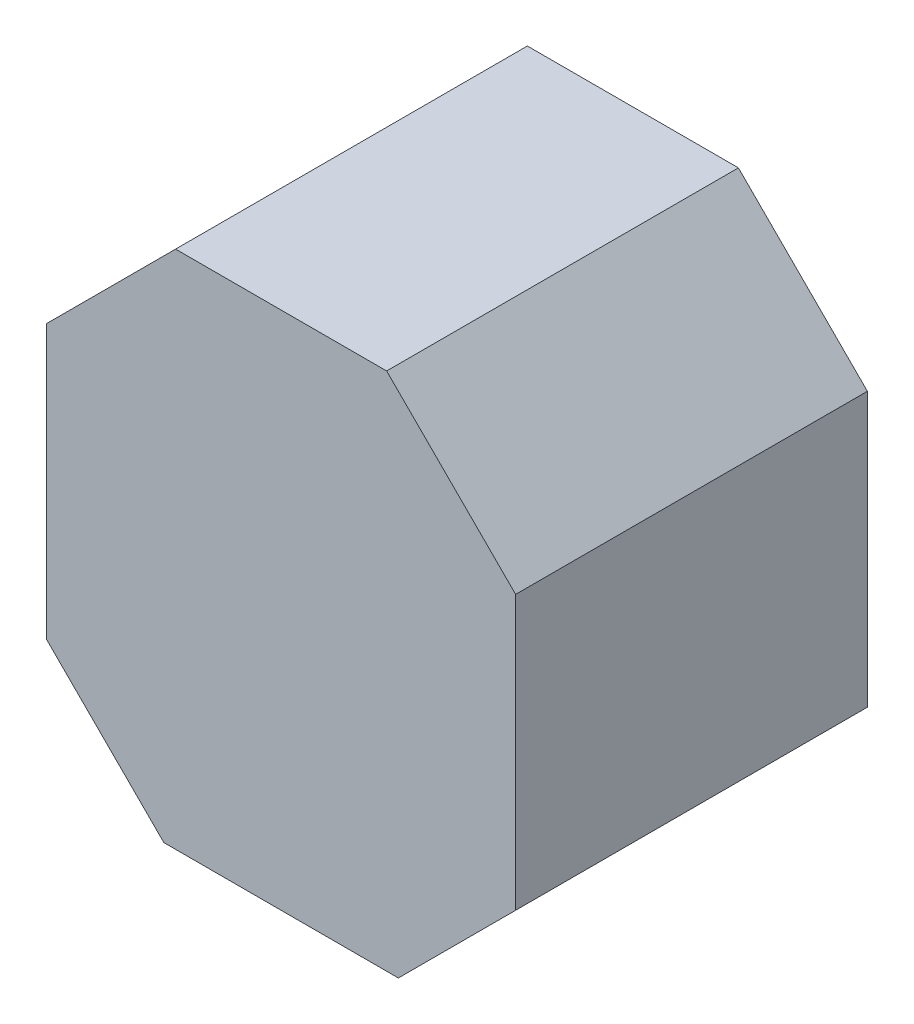
ISO-10303-21;
HEADER;
FILE_DESCRIPTION(('STEP AP214'),'2;1');
FILE_NAME('part.step','',(''),(''),'','','');
FILE_SCHEMA(('AUTOMOTIVE_DESIGN { 1 0 10303 214 1 1 1 1 }'));
ENDSEC;
DATA;
#1=APPLICATION_CONTEXT('core data for automotive mechanical design processes');
#2=APPLICATION_PROTOCOL_DEFINITION('international standard','automotive_design',2000,#1);
#3=PRODUCT_CONTEXT('',#1,'mechanical');
#4=PRODUCT('Part','Part','',(#3));
#5=PRODUCT_RELATED_PRODUCT_CATEGORY('part','',(#4));
#6=PRODUCT_DEFINITION_FORMATION('','',#4);
#7=PRODUCT_DEFINITION_CONTEXT('part definition',#1,'design');
#8=PRODUCT_DEFINITION('design','',#6,#7);
#9=PRODUCT_DEFINITION_SHAPE('','',#8);
#10=(LENGTH_UNIT() NAMED_UNIT(*) SI_UNIT(.MILLI.,.METRE.));
#11=(NAMED_UNIT(*) PLANE_ANGLE_UNIT() SI_UNIT($,.RADIAN.));
#12=(NAMED_UNIT(*) SI_UNIT($,.STERADIAN.) SOLID_ANGLE_UNIT());
#13=UNCERTAINTY_MEASURE_WITH_UNIT(LENGTH_MEASURE(1.E-05),#10,'distance_accuracy_value','');
#14=(GEOMETRIC_REPRESENTATION_CONTEXT(3) GLOBAL_UNCERTAINTY_ASSIGNED_CONTEXT((#13)) GLOBAL_UNIT_ASSIGNED_CONTEXT((#10,
#11,#12)) REPRESENTATION_CONTEXT('',''));
#15=CARTESIAN_POINT('',(0.,0.,0.));
#16=DIRECTION('',(0.,0.,1.));
#17=DIRECTION('',(1.,0.,0.));
#18=AXIS2_PLACEMENT_3D('',#15,#16,#17);
#19=CARTESIAN_POINT('',(-2.99999908,1.67499792,4.50000116));
#20=DIRECTION('',(0.,0.,-1.));
#21=DIRECTION('',(-1.,0.,0.));
#22=AXIS2_PLACEMENT_3D('',#19,#20,#21);
#23=PLANE('',#22);
#24=DIRECTION('',(-0.707106781186548,0.707106781186548,0.));
#25=VECTOR('',#24,1.);
#26=CARTESIAN_POINT('',(-2.99999908,-1.82499762,4.50000116));
#27=LINE('',#26,#25);
#28=CARTESIAN_POINT('',(-2.99999908,-1.82499762,4.50000116));
#29=VERTEX_POINT('',#28);
#30=CARTESIAN_POINT('',(-1.499997,-3.3249997,4.50000116));
#31=VERTEX_POINT('',#30);
#32=EDGE_CURVE('E116',#29,#31,#27,.F.);
#33=ORIENTED_EDGE('',*,*,#32,.T.);
#34=DIRECTION('',(1.,0.,0.));
#35=VECTOR('',#34,1.);
#36=CARTESIAN_POINT('',(-1.499997,-3.3249997,4.50000116));
#37=LINE('',#36,#35);
#38=CARTESIAN_POINT('',(1.50000208,-3.3249997,4.50000116));
#39=VERTEX_POINT('',#38);
#40=EDGE_CURVE('E112',#31,#39,#37,.T.);
#41=ORIENTED_EDGE('',*,*,#40,.T.);
#42=DIRECTION('',(-0.707106781186548,-0.707106781186548,0.));
#43=VECTOR('',#42,1.);
#44=CARTESIAN_POINT('',(1.50000208,-3.3249997,4.50000116));
#45=LINE('',#44,#43);
#46=CARTESIAN_POINT('',(3.00000162,-1.82500016,4.50000116));
#47=VERTEX_POINT('',#46);
#48=EDGE_CURVE('E108',#39,#47,#45,.F.);
#49=ORIENTED_EDGE('',*,*,#48,.T.);
#50=DIRECTION('',(0.,1.,0.));
#51=VECTOR('',#50,1.);
#52=CARTESIAN_POINT('',(3.00000162,-1.82500016,4.50000116));
#53=LINE('',#52,#51);
#54=CARTESIAN_POINT('',(3.00000162,1.67500046,4.50000116));
#55=VERTEX_POINT('',#54);
#56=EDGE_CURVE('E104',#47,#55,#53,.T.);
#57=ORIENTED_EDGE('',*,*,#56,.T.);
#58=DIRECTION('',(0.707106781186548,-0.707106781186548,0.));
#59=VECTOR('',#58,1.);
#60=CARTESIAN_POINT('',(3.00000162,1.67500046,4.50000116));
#61=LINE('',#60,#59);
#62=CARTESIAN_POINT('',(1.35000238,3.3249997,4.50000116));
#63=VERTEX_POINT('',#62);
#64=EDGE_CURVE('E80',#55,#63,#61,.F.);
#65=ORIENTED_EDGE('',*,*,#64,.T.);
#66=DIRECTION('',(1.,0.,0.));
#67=VECTOR('',#66,1.);
#68=CARTESIAN_POINT('',(1.35000238,3.3249997,4.50000116));
#69=LINE('',#68,#67);
#70=CARTESIAN_POINT('',(-1.3499973,3.3249997,4.50000116));
#71=VERTEX_POINT('',#70);
#72=EDGE_CURVE('E82',#63,#71,#69,.F.);
#73=ORIENTED_EDGE('',*,*,#72,.T.);
#74=DIRECTION('',(0.707106781186548,0.707106781186548,0.));
#75=VECTOR('',#74,1.);
#76=CARTESIAN_POINT('',(-1.3499973,3.3249997,4.50000116));
#77=LINE('',#76,#75);
#78=CARTESIAN_POINT('',(-2.99999908,1.67499792,4.50000116));
#79=VERTEX_POINT('',#78);
#80=EDGE_CURVE('E20',#71,#79,#77,.F.);
#81=ORIENTED_EDGE('',*,*,#80,.T.);
#82=DIRECTION('',(0.,1.,0.));
#83=VECTOR('',#82,1.);
#84=CARTESIAN_POINT('',(-2.99999908,1.67499792,4.50000116));
#85=LINE('',#84,#83);
#86=EDGE_CURVE('E121',#79,#29,#85,.F.);
#87=ORIENTED_EDGE('',*,*,#86,.T.);
#88=EDGE_LOOP('',(#33,#41,#49,#57,#65,#73,#81,#87));
#89=FACE_BOUND('',#88,.T.);
#90=ADVANCED_FACE('F17',(#89),#23,.F.);
#91=CARTESIAN_POINT('',(-1.3499973,3.3249997,0.));
#92=DIRECTION('',(0.707106781186548,-0.707106781186548,0.));
#93=DIRECTION('',(0.707106781186548,0.707106781186548,0.));
#94=AXIS2_PLACEMENT_3D('',#91,#92,#93);
#95=PLANE('',#94);
#96=DIRECTION('',(0.,0.,-1.));
#97=VECTOR('',#96,1.);
#98=CARTESIAN_POINT('',(-2.99999908,1.67499792,0.));
#99=LINE('',#98,#97);
#100=CARTESIAN_POINT('',(-2.99999908,1.67499792,0.));
#101=VERTEX_POINT('',#100);
#102=EDGE_CURVE('E93',#101,#79,#99,.F.);
#103=ORIENTED_EDGE('',*,*,#102,.T.);
#104=ORIENTED_EDGE('',*,*,#80,.F.);
#105=DIRECTION('',(0.,0.,-1.));
#106=VECTOR('',#105,1.);
#107=CARTESIAN_POINT('',(-1.3499973,3.3249997,0.));
#108=LINE('',#107,#106);
#109=CARTESIAN_POINT('',(-1.3499973,3.3249997,0.));
#110=VERTEX_POINT('',#109);
#111=EDGE_CURVE('E88',#71,#110,#108,.T.);
#112=ORIENTED_EDGE('',*,*,#111,.T.);
#113=DIRECTION('',(0.707106781186548,0.707106781186547,0.));
#114=VECTOR('',#113,1.);
#115=CARTESIAN_POINT('',(-2.99999908,1.67499792,0.));
#116=LINE('',#115,#114);
#117=EDGE_CURVE('E124',#101,#110,#116,.T.);
#118=ORIENTED_EDGE('',*,*,#117,.F.);
#119=EDGE_LOOP('',(#103,#104,#112,#118));
#120=FACE_BOUND('',#119,.T.);
#121=ADVANCED_FACE('F90',(#120),#95,.F.);
#122=CARTESIAN_POINT('',(1.35000238,3.3249997,0.));
#123=DIRECTION('',(0.,-1.,0.));
#124=DIRECTION('',(0.,0.,-1.));
#125=AXIS2_PLACEMENT_3D('',#122,#123,#124);
#126=PLANE('',#125);
#127=ORIENTED_EDGE('',*,*,#111,.F.);
#128=ORIENTED_EDGE('',*,*,#72,.F.);
#129=DIRECTION('',(0.,0.,1.));
#130=VECTOR('',#129,1.);
#131=CARTESIAN_POINT('',(1.35000238,3.3249997,0.));
#132=LINE('',#131,#130);
#133=CARTESIAN_POINT('',(1.35000238,3.3249997,0.));
#134=VERTEX_POINT('',#133);
#135=EDGE_CURVE('E100',#63,#134,#132,.F.);
#136=ORIENTED_EDGE('',*,*,#135,.T.);
#137=DIRECTION('',(-1.,0.,0.));
#138=VECTOR('',#137,1.);
#139=CARTESIAN_POINT('',(-2.99999908,3.3249997,0.));
#140=LINE('',#139,#138);
#141=EDGE_CURVE('E97',#110,#134,#140,.F.);
#142=ORIENTED_EDGE('',*,*,#141,.F.);
#143=EDGE_LOOP('',(#127,#128,#136,#142));
#144=FACE_BOUND('',#143,.T.);
#145=ADVANCED_FACE('F95',(#144),#126,.F.);
#146=CARTESIAN_POINT('',(3.00000162,1.67500046,0.));
#147=DIRECTION('',(-0.707106781186548,-0.707106781186548,0.));
#148=DIRECTION('',(0.707106781186548,-0.707106781186548,0.));
#149=AXIS2_PLACEMENT_3D('',#146,#147,#148);
#150=PLANE('',#149);
#151=ORIENTED_EDGE('',*,*,#135,.F.);
#152=ORIENTED_EDGE('',*,*,#64,.F.);
#153=DIRECTION('',(0.,0.,1.));
#154=VECTOR('',#153,1.);
#155=CARTESIAN_POINT('',(3.00000162,1.67500046,0.));
#156=LINE('',#155,#154);
#157=CARTESIAN_POINT('',(3.00000162,1.67500046,0.));
#158=VERTEX_POINT('',#157);
#159=EDGE_CURVE('E106',#55,#158,#156,.F.);
#160=ORIENTED_EDGE('',*,*,#159,.T.);
#161=DIRECTION('',(0.707106781186548,-0.707106781186547,0.));
#162=VECTOR('',#161,1.);
#163=CARTESIAN_POINT('',(1.35000238,3.3249997,0.));
#164=LINE('',#163,#162);
#165=EDGE_CURVE('E127',#134,#158,#164,.T.);
#166=ORIENTED_EDGE('',*,*,#165,.F.);
#167=EDGE_LOOP('',(#151,#152,#160,#166));
#168=FACE_BOUND('',#167,.T.);
#169=ADVANCED_FACE('F160',(#168),#150,.F.);
#170=CARTESIAN_POINT('',(3.00000162,-1.82500016,0.));
#171=DIRECTION('',(-1.,0.,0.));
#172=DIRECTION('',(0.,0.,1.));
#173=AXIS2_PLACEMENT_3D('',#170,#171,#172);
#174=PLANE('',#173);
#175=ORIENTED_EDGE('',*,*,#159,.F.);
#176=ORIENTED_EDGE('',*,*,#56,.F.);
#177=DIRECTION('',(0.,0.,1.));
#178=VECTOR('',#177,1.);
#179=CARTESIAN_POINT('',(3.00000162,-1.82500016,0.));
#180=LINE('',#179,#178);
#181=CARTESIAN_POINT('',(3.00000162,-1.82500016,0.));
#182=VERTEX_POINT('',#181);
#183=EDGE_CURVE('E110',#47,#182,#180,.F.);
#184=ORIENTED_EDGE('',*,*,#183,.T.);
#185=DIRECTION('',(0.,1.,0.));
#186=VECTOR('',#185,1.);
#187=CARTESIAN_POINT('',(3.00000162,1.67499792,0.));
#188=LINE('',#187,#186);
#189=EDGE_CURVE('E130',#158,#182,#188,.F.);
#190=ORIENTED_EDGE('',*,*,#189,.F.);
#191=EDGE_LOOP('',(#175,#176,#184,#190));
#192=FACE_BOUND('',#191,.T.);
#193=ADVANCED_FACE('F158',(#192),#174,.F.);
#194=CARTESIAN_POINT('',(1.50000208,-3.3249997,0.));
#195=DIRECTION('',(-0.707106781186548,0.707106781186548,0.));
#196=DIRECTION('',(-0.707106781186548,-0.707106781186548,0.));
#197=AXIS2_PLACEMENT_3D('',#194,#195,#196);
#198=PLANE('',#197);
#199=ORIENTED_EDGE('',*,*,#183,.F.);
#200=ORIENTED_EDGE('',*,*,#48,.F.);
#201=DIRECTION('',(0.,0.,1.));
#202=VECTOR('',#201,1.);
#203=CARTESIAN_POINT('',(1.50000208,-3.3249997,0.));
#204=LINE('',#203,#202);
#205=CARTESIAN_POINT('',(1.50000208,-3.3249997,0.));
#206=VERTEX_POINT('',#205);
#207=EDGE_CURVE('E114',#39,#206,#204,.F.);
#208=ORIENTED_EDGE('',*,*,#207,.T.);
#209=DIRECTION('',(-0.707106781186548,-0.707106781186547,0.));
#210=VECTOR('',#209,1.);
#211=CARTESIAN_POINT('',(3.00000162,-1.82500016,0.));
#212=LINE('',#211,#210);
#213=EDGE_CURVE('E133',#182,#206,#212,.T.);
#214=ORIENTED_EDGE('',*,*,#213,.F.);
#215=EDGE_LOOP('',(#199,#200,#208,#214));
#216=FACE_BOUND('',#215,.T.);
#217=ADVANCED_FACE('F153',(#216),#198,.F.);
#218=CARTESIAN_POINT('',(-1.499997,-3.3249997,0.));
#219=DIRECTION('',(0.,1.,0.));
#220=DIRECTION('',(0.,0.,1.));
#221=AXIS2_PLACEMENT_3D('',#218,#219,#220);
#222=PLANE('',#221);
#223=ORIENTED_EDGE('',*,*,#207,.F.);
#224=ORIENTED_EDGE('',*,*,#40,.F.);
#225=DIRECTION('',(0.,0.,1.));
#226=VECTOR('',#225,1.);
#227=CARTESIAN_POINT('',(-1.499997,-3.3249997,0.));
#228=LINE('',#227,#226);
#229=CARTESIAN_POINT('',(-1.499997,-3.3249997,0.));
#230=VERTEX_POINT('',#229);
#231=EDGE_CURVE('E118',#31,#230,#228,.F.);
#232=ORIENTED_EDGE('',*,*,#231,.T.);
#233=DIRECTION('',(-1.,0.,0.));
#234=VECTOR('',#233,1.);
#235=CARTESIAN_POINT('',(-2.99999908,-3.3249997,0.));
#236=LINE('',#235,#234);
#237=EDGE_CURVE('E136',#206,#230,#236,.T.);
#238=ORIENTED_EDGE('',*,*,#237,.F.);
#239=EDGE_LOOP('',(#223,#224,#232,#238));
#240=FACE_BOUND('',#239,.T.);
#241=ADVANCED_FACE('F148',(#240),#222,.F.);
#242=CARTESIAN_POINT('',(-2.99999908,-1.82499762,0.));
#243=DIRECTION('',(0.707106781186548,0.707106781186548,0.));
#244=DIRECTION('',(-0.707106781186548,0.707106781186548,0.));
#245=AXIS2_PLACEMENT_3D('',#242,#243,#244);
#246=PLANE('',#245);
#247=ORIENTED_EDGE('',*,*,#231,.F.);
#248=ORIENTED_EDGE('',*,*,#32,.F.);
#249=DIRECTION('',(0.,0.,-1.));
#250=VECTOR('',#249,1.);
#251=CARTESIAN_POINT('',(-2.99999908,-1.82499762,0.));
#252=LINE('',#251,#250);
#253=CARTESIAN_POINT('',(-2.99999908,-1.82499762,0.));
#254=VERTEX_POINT('',#253);
#255=EDGE_CURVE('E35',#29,#254,#252,.T.);
#256=ORIENTED_EDGE('',*,*,#255,.T.);
#257=DIRECTION('',(-0.707106781186547,0.707106781186548,0.));
#258=VECTOR('',#257,1.);
#259=CARTESIAN_POINT('',(-1.499997,-3.3249997,0.));
#260=LINE('',#259,#258);
#261=EDGE_CURVE('E26',#230,#254,#260,.T.);
#262=ORIENTED_EDGE('',*,*,#261,.F.);
#263=EDGE_LOOP('',(#247,#248,#256,#262));
#264=FACE_BOUND('',#263,.T.);
#265=ADVANCED_FACE('F144',(#264),#246,.F.);
#266=CARTESIAN_POINT('',(-2.99999908,1.67499792,0.));
#267=DIRECTION('',(1.,0.,0.));
#268=DIRECTION('',(0.,0.,-1.));
#269=AXIS2_PLACEMENT_3D('',#266,#267,#268);
#270=PLANE('',#269);
#271=ORIENTED_EDGE('',*,*,#255,.F.);
#272=ORIENTED_EDGE('',*,*,#86,.F.);
#273=ORIENTED_EDGE('',*,*,#102,.F.);
#274=DIRECTION('',(0.,1.,0.));
#275=VECTOR('',#274,1.);
#276=CARTESIAN_POINT('',(-2.99999908,1.67499792,0.));
#277=LINE('',#276,#275);
#278=EDGE_CURVE('E11',#254,#101,#277,.T.);
#279=ORIENTED_EDGE('',*,*,#278,.F.);
#280=EDGE_LOOP('',(#271,#272,#273,#279));
#281=FACE_BOUND('',#280,.T.);
#282=ADVANCED_FACE('F163',(#281),#270,.F.);
#283=CARTESIAN_POINT('',(-2.99999908,1.67499792,0.));
#284=DIRECTION('',(0.,0.,-1.));
#285=DIRECTION('',(-1.,0.,0.));
#286=AXIS2_PLACEMENT_3D('',#283,#284,#285);
#287=PLANE('',#286);
#288=ORIENTED_EDGE('',*,*,#261,.T.);
#289=ORIENTED_EDGE('',*,*,#278,.T.);
#290=ORIENTED_EDGE('',*,*,#117,.T.);
#291=ORIENTED_EDGE('',*,*,#141,.T.);
#292=ORIENTED_EDGE('',*,*,#165,.T.);
#293=ORIENTED_EDGE('',*,*,#189,.T.);
#294=ORIENTED_EDGE('',*,*,#213,.T.);
#295=ORIENTED_EDGE('',*,*,#237,.T.);
#296=EDGE_LOOP('',(#288,#289,#290,#291,#292,#293,#294,#295));
#297=FACE_BOUND('',#296,.T.);
#298=ADVANCED_FACE('F141',(#297),#287,.T.);
#299=CLOSED_SHELL('',(#90,#121,#145,#169,#193,#217,#241,#265,#282,#298));
#300=MANIFOLD_SOLID_BREP('B1',#299);
#301=ADVANCED_BREP_SHAPE_REPRESENTATION('',(#18,#300),#14);
#302=SHAPE_DEFINITION_REPRESENTATION(#9,#301);
ENDSEC;
END-ISO-10303-21;
